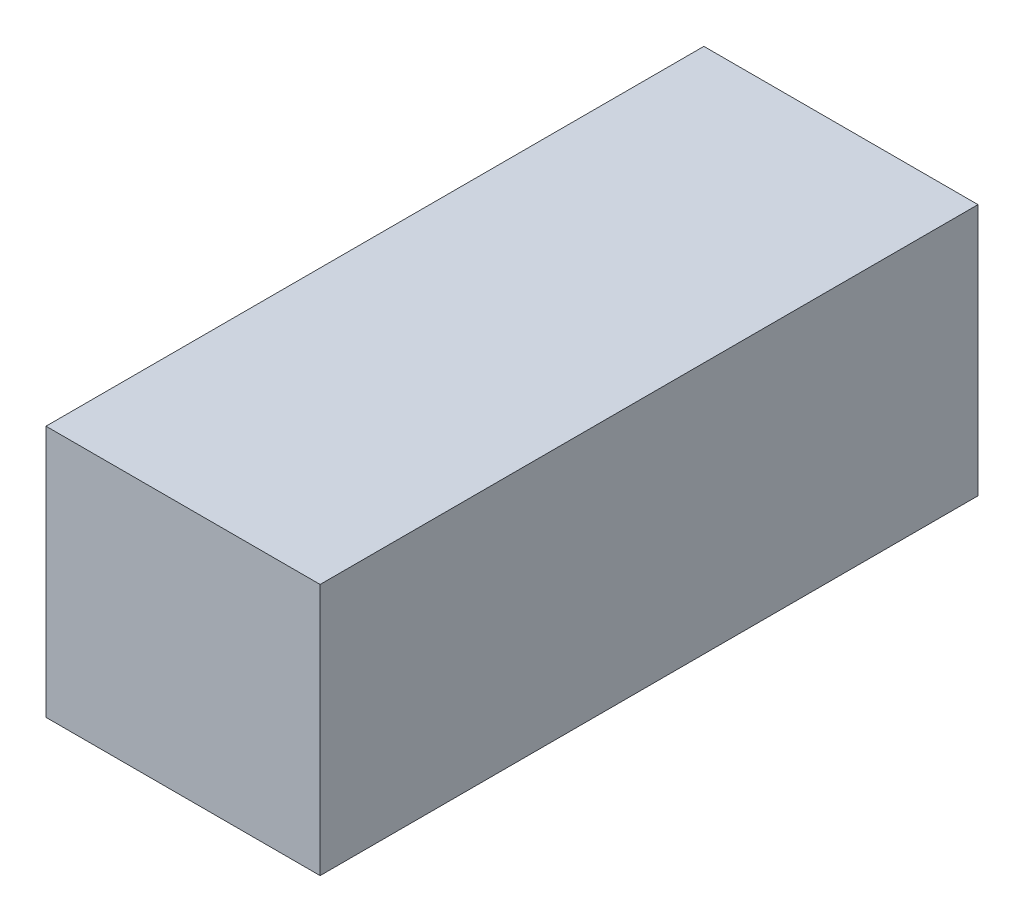
ISO-10303-21;
HEADER;
FILE_DESCRIPTION(('STEP AP214'),'2;1');
FILE_NAME('part.step','',(''),(''),'','','');
FILE_SCHEMA(('AUTOMOTIVE_DESIGN { 1 0 10303 214 1 1 1 1 }'));
ENDSEC;
DATA;
#1=APPLICATION_CONTEXT('core data for automotive mechanical design processes');
#2=APPLICATION_PROTOCOL_DEFINITION('international standard','automotive_design',2000,#1);
#3=PRODUCT_CONTEXT('',#1,'mechanical');
#4=PRODUCT('Part','Part','',(#3));
#5=PRODUCT_RELATED_PRODUCT_CATEGORY('part','',(#4));
#6=PRODUCT_DEFINITION_FORMATION('','',#4);
#7=PRODUCT_DEFINITION_CONTEXT('part definition',#1,'design');
#8=PRODUCT_DEFINITION('design','',#6,#7);
#9=PRODUCT_DEFINITION_SHAPE('','',#8);
#10=(LENGTH_UNIT() NAMED_UNIT(*) SI_UNIT(.MILLI.,.METRE.));
#11=(NAMED_UNIT(*) PLANE_ANGLE_UNIT() SI_UNIT($,.RADIAN.));
#12=(NAMED_UNIT(*) SI_UNIT($,.STERADIAN.) SOLID_ANGLE_UNIT());
#13=UNCERTAINTY_MEASURE_WITH_UNIT(LENGTH_MEASURE(1.E-05),#10,'distance_accuracy_value','');
#14=(GEOMETRIC_REPRESENTATION_CONTEXT(3) GLOBAL_UNCERTAINTY_ASSIGNED_CONTEXT((#13)) GLOBAL_UNIT_ASSIGNED_CONTEXT((#10,
#11,#12)) REPRESENTATION_CONTEXT('',''));
#15=CARTESIAN_POINT('',(0.,0.,0.));
#16=DIRECTION('',(0.,0.,1.));
#17=DIRECTION('',(1.,0.,0.));
#18=AXIS2_PLACEMENT_3D('',#15,#16,#17);
#19=CARTESIAN_POINT('',(0.,-11.5,0.));
#20=DIRECTION('',(0.,-1.,0.));
#21=DIRECTION('',(0.,0.,-1.));
#22=AXIS2_PLACEMENT_3D('',#19,#20,#21);
#23=PLANE('',#22);
#24=DIRECTION('',(0.,0.,-1.));
#25=VECTOR('',#24,1.);
#26=CARTESIAN_POINT('',(-12.5,-11.5,30.));
#27=LINE('',#26,#25);
#28=CARTESIAN_POINT('',(-12.5,-11.5,30.));
#29=VERTEX_POINT('',#28);
#30=CARTESIAN_POINT('',(-12.5,-11.5,-30.));
#31=VERTEX_POINT('',#30);
#32=EDGE_CURVE('E54',#29,#31,#27,.T.);
#33=ORIENTED_EDGE('',*,*,#32,.T.);
#34=DIRECTION('',(1.,0.,0.));
#35=VECTOR('',#34,1.);
#36=CARTESIAN_POINT('',(-12.5,-11.5,-30.));
#37=LINE('',#36,#35);
#38=CARTESIAN_POINT('',(12.5,-11.5,-30.));
#39=VERTEX_POINT('',#38);
#40=EDGE_CURVE('E75',#31,#39,#37,.T.);
#41=ORIENTED_EDGE('',*,*,#40,.T.);
#42=DIRECTION('',(0.,0.,1.));
#43=VECTOR('',#42,1.);
#44=CARTESIAN_POINT('',(12.5,-11.5,30.));
#45=LINE('',#44,#43);
#46=CARTESIAN_POINT('',(12.5,-11.5,30.));
#47=VERTEX_POINT('',#46);
#48=EDGE_CURVE('E57',#39,#47,#45,.T.);
#49=ORIENTED_EDGE('',*,*,#48,.T.);
#50=DIRECTION('',(-1.,0.,0.));
#51=VECTOR('',#50,1.);
#52=CARTESIAN_POINT('',(-12.5,-11.5,30.));
#53=LINE('',#52,#51);
#54=EDGE_CURVE('E19',#47,#29,#53,.T.);
#55=ORIENTED_EDGE('',*,*,#54,.T.);
#56=EDGE_LOOP('',(#33,#41,#49,#55));
#57=FACE_BOUND('',#56,.T.);
#58=ADVANCED_FACE('F16',(#57),#23,.T.);
#59=CARTESIAN_POINT('',(-12.5,11.5,30.));
#60=DIRECTION('',(0.,0.,-1.));
#61=DIRECTION('',(-1.,0.,0.));
#62=AXIS2_PLACEMENT_3D('',#59,#60,#61);
#63=PLANE('',#62);
#64=DIRECTION('',(0.,1.,0.));
#65=VECTOR('',#64,1.);
#66=CARTESIAN_POINT('',(12.5,11.5,30.));
#67=LINE('',#66,#65);
#68=CARTESIAN_POINT('',(12.5,11.5,30.));
#69=VERTEX_POINT('',#68);
#70=EDGE_CURVE('E77',#47,#69,#67,.T.);
#71=ORIENTED_EDGE('',*,*,#70,.T.);
#72=DIRECTION('',(1.,0.,0.));
#73=VECTOR('',#72,1.);
#74=CARTESIAN_POINT('',(0.,11.5,30.));
#75=LINE('',#74,#73);
#76=CARTESIAN_POINT('',(-12.5,11.5,30.));
#77=VERTEX_POINT('',#76);
#78=EDGE_CURVE('E72',#69,#77,#75,.F.);
#79=ORIENTED_EDGE('',*,*,#78,.T.);
#80=DIRECTION('',(0.,1.,0.));
#81=VECTOR('',#80,1.);
#82=CARTESIAN_POINT('',(-12.5,11.5,30.));
#83=LINE('',#82,#81);
#84=EDGE_CURVE('E62',#77,#29,#83,.F.);
#85=ORIENTED_EDGE('',*,*,#84,.T.);
#86=ORIENTED_EDGE('',*,*,#54,.F.);
#87=EDGE_LOOP('',(#71,#79,#85,#86));
#88=FACE_BOUND('',#87,.T.);
#89=ADVANCED_FACE('F71',(#88),#63,.F.);
#90=CARTESIAN_POINT('',(-12.5,11.5,30.));
#91=DIRECTION('',(1.,0.,0.));
#92=DIRECTION('',(0.,0.,-1.));
#93=AXIS2_PLACEMENT_3D('',#90,#91,#92);
#94=PLANE('',#93);
#95=ORIENTED_EDGE('',*,*,#84,.F.);
#96=DIRECTION('',(0.,0.,-1.));
#97=VECTOR('',#96,1.);
#98=CARTESIAN_POINT('',(-12.5,11.5,0.));
#99=LINE('',#98,#97);
#100=CARTESIAN_POINT('',(-12.5,11.5,-30.));
#101=VERTEX_POINT('',#100);
#102=EDGE_CURVE('E82',#77,#101,#99,.T.);
#103=ORIENTED_EDGE('',*,*,#102,.T.);
#104=DIRECTION('',(0.,1.,0.));
#105=VECTOR('',#104,1.);
#106=CARTESIAN_POINT('',(-12.5,11.5,-30.));
#107=LINE('',#106,#105);
#108=EDGE_CURVE('E68',#101,#31,#107,.F.);
#109=ORIENTED_EDGE('',*,*,#108,.T.);
#110=ORIENTED_EDGE('',*,*,#32,.F.);
#111=EDGE_LOOP('',(#95,#103,#109,#110));
#112=FACE_BOUND('',#111,.T.);
#113=ADVANCED_FACE('F65',(#112),#94,.F.);
#114=CARTESIAN_POINT('',(-12.5,11.5,-30.));
#115=DIRECTION('',(0.,0.,1.));
#116=DIRECTION('',(1.,0.,0.));
#117=AXIS2_PLACEMENT_3D('',#114,#115,#116);
#118=PLANE('',#117);
#119=ORIENTED_EDGE('',*,*,#108,.F.);
#120=DIRECTION('',(1.,0.,0.));
#121=VECTOR('',#120,1.);
#122=CARTESIAN_POINT('',(0.,11.5,-30.));
#123=LINE('',#122,#121);
#124=CARTESIAN_POINT('',(12.5,11.5,-30.));
#125=VERTEX_POINT('',#124);
#126=EDGE_CURVE('E25',#101,#125,#123,.T.);
#127=ORIENTED_EDGE('',*,*,#126,.T.);
#128=DIRECTION('',(0.,1.,0.));
#129=VECTOR('',#128,1.);
#130=CARTESIAN_POINT('',(12.5,11.5,-30.));
#131=LINE('',#130,#129);
#132=EDGE_CURVE('E33',#125,#39,#131,.F.);
#133=ORIENTED_EDGE('',*,*,#132,.T.);
#134=ORIENTED_EDGE('',*,*,#40,.F.);
#135=EDGE_LOOP('',(#119,#127,#133,#134));
#136=FACE_BOUND('',#135,.T.);
#137=ADVANCED_FACE('F87',(#136),#118,.F.);
#138=CARTESIAN_POINT('',(12.5,11.5,30.));
#139=DIRECTION('',(-1.,0.,0.));
#140=DIRECTION('',(0.,0.,1.));
#141=AXIS2_PLACEMENT_3D('',#138,#139,#140);
#142=PLANE('',#141);
#143=ORIENTED_EDGE('',*,*,#132,.F.);
#144=DIRECTION('',(0.,0.,-1.));
#145=VECTOR('',#144,1.);
#146=CARTESIAN_POINT('',(12.5,11.5,0.));
#147=LINE('',#146,#145);
#148=EDGE_CURVE('E11',#125,#69,#147,.F.);
#149=ORIENTED_EDGE('',*,*,#148,.T.);
#150=ORIENTED_EDGE('',*,*,#70,.F.);
#151=ORIENTED_EDGE('',*,*,#48,.F.);
#152=EDGE_LOOP('',(#143,#149,#150,#151));
#153=FACE_BOUND('',#152,.T.);
#154=ADVANCED_FACE('F90',(#153),#142,.F.);
#155=CARTESIAN_POINT('',(0.,11.5,0.));
#156=DIRECTION('',(0.,-1.,0.));
#157=DIRECTION('',(0.,0.,-1.));
#158=AXIS2_PLACEMENT_3D('',#155,#156,#157);
#159=PLANE('',#158);
#160=ORIENTED_EDGE('',*,*,#126,.F.);
#161=ORIENTED_EDGE('',*,*,#102,.F.);
#162=ORIENTED_EDGE('',*,*,#78,.F.);
#163=ORIENTED_EDGE('',*,*,#148,.F.);
#164=EDGE_LOOP('',(#160,#161,#162,#163));
#165=FACE_BOUND('',#164,.T.);
#166=ADVANCED_FACE('F89',(#165),#159,.F.);
#167=CLOSED_SHELL('',(#58,#89,#113,#137,#154,#166));
#168=MANIFOLD_SOLID_BREP('B1',#167);
#169=ADVANCED_BREP_SHAPE_REPRESENTATION('',(#18,#168),#14);
#170=SHAPE_DEFINITION_REPRESENTATION(#9,#169);
ENDSEC;
END-ISO-10303-21;
